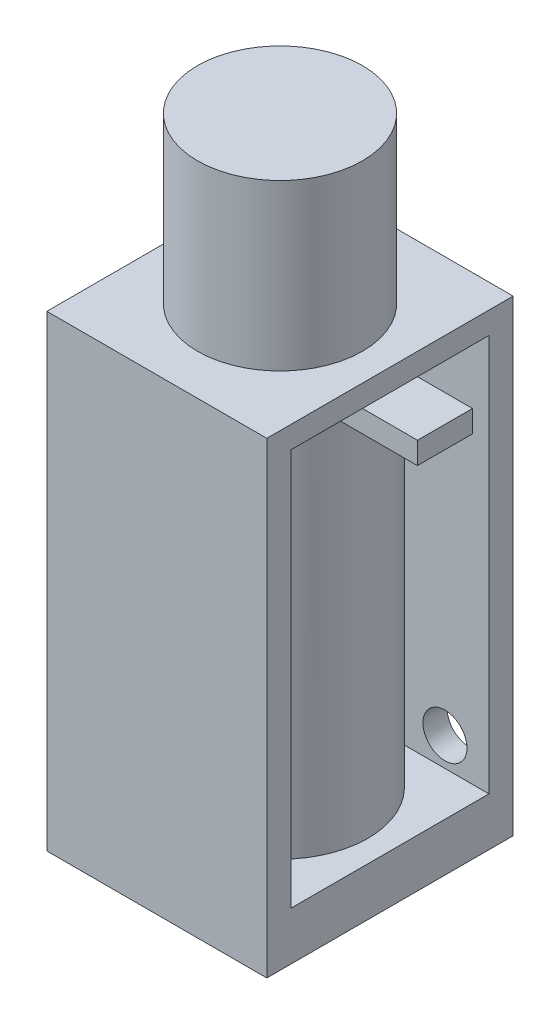
ISO-10303-21;
HEADER;
FILE_DESCRIPTION(('STEP AP214'),'2;1');
FILE_NAME('part.step','',(''),(''),'','','');
FILE_SCHEMA(('AUTOMOTIVE_DESIGN { 1 0 10303 214 1 1 1 1 }'));
ENDSEC;
DATA;
#1=APPLICATION_CONTEXT('core data for automotive mechanical design processes');
#2=APPLICATION_PROTOCOL_DEFINITION('international standard','automotive_design',2000,#1);
#3=PRODUCT_CONTEXT('',#1,'mechanical');
#4=PRODUCT('Part','Part','',(#3));
#5=PRODUCT_RELATED_PRODUCT_CATEGORY('part','',(#4));
#6=PRODUCT_DEFINITION_FORMATION('','',#4);
#7=PRODUCT_DEFINITION_CONTEXT('part definition',#1,'design');
#8=PRODUCT_DEFINITION('design','',#6,#7);
#9=PRODUCT_DEFINITION_SHAPE('','',#8);
#10=(LENGTH_UNIT() NAMED_UNIT(*) SI_UNIT(.MILLI.,.METRE.));
#11=(NAMED_UNIT(*) PLANE_ANGLE_UNIT() SI_UNIT($,.RADIAN.));
#12=(NAMED_UNIT(*) SI_UNIT($,.STERADIAN.) SOLID_ANGLE_UNIT());
#13=UNCERTAINTY_MEASURE_WITH_UNIT(LENGTH_MEASURE(1.E-05),#10,'distance_accuracy_value','');
#14=(GEOMETRIC_REPRESENTATION_CONTEXT(3) GLOBAL_UNCERTAINTY_ASSIGNED_CONTEXT((#13)) GLOBAL_UNIT_ASSIGNED_CONTEXT((#10,
#11,#12)) REPRESENTATION_CONTEXT('',''));
#15=CARTESIAN_POINT('',(0.,0.,0.));
#16=DIRECTION('',(0.,0.,1.));
#17=DIRECTION('',(1.,0.,0.));
#18=AXIS2_PLACEMENT_3D('',#15,#16,#17);
#19=CARTESIAN_POINT('',(0.,18.,0.));
#20=DIRECTION('',(0.,-1.,0.));
#21=DIRECTION('',(0.,0.,-1.));
#22=AXIS2_PLACEMENT_3D('',#19,#20,#21);
#23=CYLINDRICAL_SURFACE('',#22,4.);
#24=CARTESIAN_POINT('',(0.,17.05,0.));
#25=DIRECTION('',(0.,-1.,0.));
#26=DIRECTION('',(0.,0.,-1.));
#27=AXIS2_PLACEMENT_3D('',#24,#25,#26);
#28=CIRCLE('',#27,4.);
#29=CARTESIAN_POINT('',(3.79967103839267,17.05,-1.25));
#30=VERTEX_POINT('',#29);
#31=CARTESIAN_POINT('',(3.79967103839267,17.05,1.25));
#32=VERTEX_POINT('',#31);
#33=EDGE_CURVE('E11',#30,#32,#28,.T.);
#34=ORIENTED_EDGE('',*,*,#33,.T.);
#35=DIRECTION('',(0.,-1.,0.));
#36=VECTOR('',#35,1.);
#37=CARTESIAN_POINT('',(3.79967103839267,18.,1.25));
#38=LINE('',#37,#36);
#39=CARTESIAN_POINT('',(3.79967103839267,18.,1.25));
#40=VERTEX_POINT('',#39);
#41=EDGE_CURVE('E157',#32,#40,#38,.F.);
#42=ORIENTED_EDGE('',*,*,#41,.T.);
#43=CARTESIAN_POINT('',(0.,18.,0.));
#44=DIRECTION('',(0.,1.,0.));
#45=DIRECTION('',(0.,0.,1.));
#46=AXIS2_PLACEMENT_3D('',#43,#44,#45);
#47=CIRCLE('',#46,4.);
#48=CARTESIAN_POINT('',(3.79967103839267,18.,-1.25));
#49=VERTEX_POINT('',#48);
#50=EDGE_CURVE('E49',#49,#40,#47,.T.);
#51=ORIENTED_EDGE('',*,*,#50,.F.);
#52=DIRECTION('',(0.,-1.,0.));
#53=VECTOR('',#52,1.);
#54=CARTESIAN_POINT('',(3.79967103839267,18.,-1.25));
#55=LINE('',#54,#53);
#56=EDGE_CURVE('E56',#30,#49,#55,.F.);
#57=ORIENTED_EDGE('',*,*,#56,.F.);
#58=EDGE_LOOP('',(#34,#42,#51,#57));
#59=FACE_BOUND('',#58,.T.);
#60=CARTESIAN_POINT('',(0.,0.,0.));
#61=DIRECTION('',(0.,1.,0.));
#62=DIRECTION('',(0.,0.,1.));
#63=AXIS2_PLACEMENT_3D('',#60,#61,#62);
#64=CIRCLE('',#63,4.);
#65=CARTESIAN_POINT('',(0.,0.,4.));
#66=VERTEX_POINT('',#65);
#67=EDGE_CURVE('E336',#66,#66,#64,.T.);
#68=ORIENTED_EDGE('',*,*,#67,.T.);
#69=EDGE_LOOP('',(#68));
#70=FACE_BOUND('',#69,.T.);
#71=ADVANCED_FACE('F41',(#59,#70),#23,.T.);
#72=CARTESIAN_POINT('',(0.,18.,0.));
#73=DIRECTION('',(0.,1.,0.));
#74=DIRECTION('',(0.,0.,1.));
#75=AXIS2_PLACEMENT_3D('',#72,#73,#74);
#76=PLANE('',#75);
#77=DIRECTION('',(1.,0.,0.));
#78=VECTOR('',#77,1.);
#79=CARTESIAN_POINT('',(0.,18.,1.25));
#80=LINE('',#79,#78);
#81=CARTESIAN_POINT('',(3.,18.,1.25));
#82=VERTEX_POINT('',#81);
#83=EDGE_CURVE('E211',#82,#40,#80,.T.);
#84=ORIENTED_EDGE('',*,*,#83,.F.);
#85=DIRECTION('',(0.,0.,-1.));
#86=VECTOR('',#85,1.);
#87=CARTESIAN_POINT('',(3.,18.,0.));
#88=LINE('',#87,#86);
#89=CARTESIAN_POINT('',(3.,18.,-1.25));
#90=VERTEX_POINT('',#89);
#91=EDGE_CURVE('E207',#82,#90,#88,.T.);
#92=ORIENTED_EDGE('',*,*,#91,.T.);
#93=DIRECTION('',(1.,0.,0.));
#94=VECTOR('',#93,1.);
#95=CARTESIAN_POINT('',(0.,18.,-1.25));
#96=LINE('',#95,#94);
#97=EDGE_CURVE('E171',#90,#49,#96,.T.);
#98=ORIENTED_EDGE('',*,*,#97,.T.);
#99=ORIENTED_EDGE('',*,*,#50,.T.);
#100=EDGE_LOOP('',(#84,#92,#98,#99));
#101=FACE_BOUND('',#100,.T.);
#102=ADVANCED_FACE('F344',(#101),#76,.T.);
#103=CARTESIAN_POINT('',(5.,0.,0.));
#104=DIRECTION('',(1.,0.,0.));
#105=DIRECTION('',(0.,0.,-1.));
#106=AXIS2_PLACEMENT_3D('',#103,#104,#105);
#107=PLANE('',#106);
#108=DIRECTION('',(0.,-1.,0.));
#109=VECTOR('',#108,1.);
#110=CARTESIAN_POINT('',(5.,19.05,5.6));
#111=LINE('',#110,#109);
#112=CARTESIAN_POINT('',(5.,19.05,5.6));
#113=VERTEX_POINT('',#112);
#114=CARTESIAN_POINT('',(5.,-2.2,5.6));
#115=VERTEX_POINT('',#114);
#116=EDGE_CURVE('E295',#113,#115,#111,.T.);
#117=ORIENTED_EDGE('',*,*,#116,.T.);
#118=DIRECTION('',(0.,0.,-1.));
#119=VECTOR('',#118,1.);
#120=CARTESIAN_POINT('',(5.,-2.2,5.6));
#121=LINE('',#120,#119);
#122=CARTESIAN_POINT('',(5.,-2.2,-5.6));
#123=VERTEX_POINT('',#122);
#124=EDGE_CURVE('E299',#115,#123,#121,.T.);
#125=ORIENTED_EDGE('',*,*,#124,.T.);
#126=DIRECTION('',(0.,1.,0.));
#127=VECTOR('',#126,1.);
#128=CARTESIAN_POINT('',(5.,19.05,-5.6));
#129=LINE('',#128,#127);
#130=CARTESIAN_POINT('',(5.,19.05,-5.6));
#131=VERTEX_POINT('',#130);
#132=EDGE_CURVE('E303',#123,#131,#129,.T.);
#133=ORIENTED_EDGE('',*,*,#132,.T.);
#134=DIRECTION('',(0.,0.,1.));
#135=VECTOR('',#134,1.);
#136=CARTESIAN_POINT('',(5.,19.05,5.6));
#137=LINE('',#136,#135);
#138=EDGE_CURVE('E306',#131,#113,#137,.T.);
#139=ORIENTED_EDGE('',*,*,#138,.T.);
#140=EDGE_LOOP('',(#117,#125,#133,#139));
#141=FACE_BOUND('',#140,.T.);
#142=DIRECTION('',(0.,0.,-1.));
#143=VECTOR('',#142,1.);
#144=CARTESIAN_POINT('',(5.,0.,4.5));
#145=LINE('',#144,#143);
#146=CARTESIAN_POINT('',(5.,0.,4.5));
#147=VERTEX_POINT('',#146);
#148=CARTESIAN_POINT('',(5.,0.,-4.5));
#149=VERTEX_POINT('',#148);
#150=EDGE_CURVE('E252',#147,#149,#145,.T.);
#151=ORIENTED_EDGE('',*,*,#150,.F.);
#152=DIRECTION('',(0.,-1.,0.));
#153=VECTOR('',#152,1.);
#154=CARTESIAN_POINT('',(5.,0.,4.5));
#155=LINE('',#154,#153);
#156=CARTESIAN_POINT('',(5.,18.05,4.5));
#157=VERTEX_POINT('',#156);
#158=EDGE_CURVE('E249',#157,#147,#155,.T.);
#159=ORIENTED_EDGE('',*,*,#158,.F.);
#160=DIRECTION('',(0.,0.,1.));
#161=VECTOR('',#160,1.);
#162=CARTESIAN_POINT('',(5.,18.05,4.5));
#163=LINE('',#162,#161);
#164=CARTESIAN_POINT('',(5.,18.05,1.25));
#165=VERTEX_POINT('',#164);
#166=EDGE_CURVE('E260',#165,#157,#163,.T.);
#167=ORIENTED_EDGE('',*,*,#166,.F.);
#168=CARTESIAN_POINT('',(5.,18.05,-1.25));
#169=VERTEX_POINT('',#168);
#170=EDGE_CURVE('E266',#169,#165,#163,.T.);
#171=ORIENTED_EDGE('',*,*,#170,.F.);
#172=CARTESIAN_POINT('',(5.,18.05,-4.5));
#173=VERTEX_POINT('',#172);
#174=EDGE_CURVE('E261',#173,#169,#163,.T.);
#175=ORIENTED_EDGE('',*,*,#174,.F.);
#176=DIRECTION('',(0.,1.,0.));
#177=VECTOR('',#176,1.);
#178=CARTESIAN_POINT('',(5.,0.,-4.5));
#179=LINE('',#178,#177);
#180=EDGE_CURVE('E256',#149,#173,#179,.T.);
#181=ORIENTED_EDGE('',*,*,#180,.F.);
#182=EDGE_LOOP('',(#151,#159,#167,#171,#175,#181));
#183=FACE_BOUND('',#182,.T.);
#184=ADVANCED_FACE('F363',(#141,#183),#107,.T.);
#185=CARTESIAN_POINT('',(-5.,0.,0.));
#186=DIRECTION('',(1.,0.,0.));
#187=DIRECTION('',(0.,0.,-1.));
#188=AXIS2_PLACEMENT_3D('',#185,#186,#187);
#189=PLANE('',#188);
#190=DIRECTION('',(0.,-1.,0.));
#191=VECTOR('',#190,1.);
#192=CARTESIAN_POINT('',(-5.,19.05,5.6));
#193=LINE('',#192,#191);
#194=CARTESIAN_POINT('',(-5.,19.05,5.6));
#195=VERTEX_POINT('',#194);
#196=CARTESIAN_POINT('',(-5.,-2.2,5.6));
#197=VERTEX_POINT('',#196);
#198=EDGE_CURVE('E294',#195,#197,#193,.T.);
#199=ORIENTED_EDGE('',*,*,#198,.F.);
#200=DIRECTION('',(0.,0.,1.));
#201=VECTOR('',#200,1.);
#202=CARTESIAN_POINT('',(-5.,19.05,5.6));
#203=LINE('',#202,#201);
#204=CARTESIAN_POINT('',(-5.,19.05,-5.6));
#205=VERTEX_POINT('',#204);
#206=EDGE_CURVE('E300',#205,#195,#203,.T.);
#207=ORIENTED_EDGE('',*,*,#206,.F.);
#208=DIRECTION('',(0.,1.,0.));
#209=VECTOR('',#208,1.);
#210=CARTESIAN_POINT('',(-5.,19.05,-5.6));
#211=LINE('',#210,#209);
#212=CARTESIAN_POINT('',(-5.,-2.2,-5.6));
#213=VERTEX_POINT('',#212);
#214=EDGE_CURVE('E316',#213,#205,#211,.T.);
#215=ORIENTED_EDGE('',*,*,#214,.F.);
#216=DIRECTION('',(0.,0.,-1.));
#217=VECTOR('',#216,1.);
#218=CARTESIAN_POINT('',(-5.,-2.2,5.6));
#219=LINE('',#218,#217);
#220=EDGE_CURVE('E313',#197,#213,#219,.T.);
#221=ORIENTED_EDGE('',*,*,#220,.F.);
#222=EDGE_LOOP('',(#199,#207,#215,#221));
#223=FACE_BOUND('',#222,.T.);
#224=DIRECTION('',(0.,-1.,0.));
#225=VECTOR('',#224,1.);
#226=CARTESIAN_POINT('',(-5.,0.,4.5));
#227=LINE('',#226,#225);
#228=CARTESIAN_POINT('',(-5.,18.05,4.5));
#229=VERTEX_POINT('',#228);
#230=CARTESIAN_POINT('',(-5.,0.,4.5));
#231=VERTEX_POINT('',#230);
#232=EDGE_CURVE('E245',#229,#231,#227,.T.);
#233=ORIENTED_EDGE('',*,*,#232,.T.);
#234=DIRECTION('',(0.,0.,-1.));
#235=VECTOR('',#234,1.);
#236=CARTESIAN_POINT('',(-5.,0.,4.5));
#237=LINE('',#236,#235);
#238=CARTESIAN_POINT('',(-5.,0.,-4.5));
#239=VERTEX_POINT('',#238);
#240=EDGE_CURVE('E270',#231,#239,#237,.T.);
#241=ORIENTED_EDGE('',*,*,#240,.T.);
#242=DIRECTION('',(0.,1.,0.));
#243=VECTOR('',#242,1.);
#244=CARTESIAN_POINT('',(-5.,0.,-4.5));
#245=LINE('',#244,#243);
#246=CARTESIAN_POINT('',(-5.,18.05,-4.5));
#247=VERTEX_POINT('',#246);
#248=EDGE_CURVE('E274',#239,#247,#245,.T.);
#249=ORIENTED_EDGE('',*,*,#248,.T.);
#250=DIRECTION('',(0.,0.,1.));
#251=VECTOR('',#250,1.);
#252=CARTESIAN_POINT('',(-5.,18.05,4.5));
#253=LINE('',#252,#251);
#254=EDGE_CURVE('E253',#247,#229,#253,.T.);
#255=ORIENTED_EDGE('',*,*,#254,.T.);
#256=EDGE_LOOP('',(#233,#241,#249,#255));
#257=FACE_BOUND('',#256,.T.);
#258=ADVANCED_FACE('F376',(#223,#257),#189,.F.);
#259=CARTESIAN_POINT('',(5.,19.05,5.6));
#260=DIRECTION('',(0.,0.,-1.));
#261=DIRECTION('',(0.,1.,0.));
#262=AXIS2_PLACEMENT_3D('',#259,#260,#261);
#263=PLANE('',#262);
#264=ORIENTED_EDGE('',*,*,#198,.T.);
#265=DIRECTION('',(-1.,0.,0.));
#266=VECTOR('',#265,1.);
#267=CARTESIAN_POINT('',(5.,-2.2,5.6));
#268=LINE('',#267,#266);
#269=EDGE_CURVE('E332',#115,#197,#268,.T.);
#270=ORIENTED_EDGE('',*,*,#269,.F.);
#271=ORIENTED_EDGE('',*,*,#116,.F.);
#272=DIRECTION('',(-1.,0.,0.));
#273=VECTOR('',#272,1.);
#274=CARTESIAN_POINT('',(5.,19.05,5.6));
#275=LINE('',#274,#273);
#276=EDGE_CURVE('E309',#113,#195,#275,.T.);
#277=ORIENTED_EDGE('',*,*,#276,.T.);
#278=EDGE_LOOP('',(#264,#270,#271,#277));
#279=FACE_BOUND('',#278,.T.);
#280=ADVANCED_FACE('F402',(#279),#263,.F.);
#281=CARTESIAN_POINT('',(5.,-2.2,5.6));
#282=DIRECTION('',(0.,1.,0.));
#283=DIRECTION('',(0.,0.,1.));
#284=AXIS2_PLACEMENT_3D('',#281,#282,#283);
#285=PLANE('',#284);
#286=CARTESIAN_POINT('',(0.,-2.2,0.));
#287=DIRECTION('',(0.,1.,0.));
#288=DIRECTION('',(0.,0.,1.));
#289=AXIS2_PLACEMENT_3D('',#286,#287,#288);
#290=CIRCLE('',#289,1.5);
#291=CARTESIAN_POINT('',(0.,-2.2,1.5));
#292=VERTEX_POINT('',#291);
#293=EDGE_CURVE('E226',#292,#292,#290,.T.);
#294=ORIENTED_EDGE('',*,*,#293,.T.);
#295=EDGE_LOOP('',(#294));
#296=FACE_BOUND('',#295,.T.);
#297=ORIENTED_EDGE('',*,*,#220,.T.);
#298=DIRECTION('',(-1.,0.,0.));
#299=VECTOR('',#298,1.);
#300=CARTESIAN_POINT('',(5.,-2.2,-5.6));
#301=LINE('',#300,#299);
#302=EDGE_CURVE('E328',#123,#213,#301,.T.);
#303=ORIENTED_EDGE('',*,*,#302,.F.);
#304=ORIENTED_EDGE('',*,*,#124,.F.);
#305=ORIENTED_EDGE('',*,*,#269,.T.);
#306=EDGE_LOOP('',(#297,#303,#304,#305));
#307=FACE_BOUND('',#306,.T.);
#308=ADVANCED_FACE('F405',(#296,#307),#285,.F.);
#309=CARTESIAN_POINT('',(5.,19.05,-5.6));
#310=DIRECTION('',(0.,0.,1.));
#311=DIRECTION('',(0.,-1.,0.));
#312=AXIS2_PLACEMENT_3D('',#309,#310,#311);
#313=PLANE('',#312);
#314=CARTESIAN_POINT('',(3.,1.3,-5.6));
#315=DIRECTION('',(0.,0.,-1.));
#316=DIRECTION('',(0.,1.,0.));
#317=AXIS2_PLACEMENT_3D('',#314,#315,#316);
#318=CIRCLE('',#317,1.);
#319=CARTESIAN_POINT('',(3.,2.3,-5.6));
#320=VERTEX_POINT('',#319);
#321=EDGE_CURVE('E217',#320,#320,#318,.T.);
#322=ORIENTED_EDGE('',*,*,#321,.F.);
#323=EDGE_LOOP('',(#322));
#324=FACE_BOUND('',#323,.T.);
#325=CARTESIAN_POINT('',(-3.,11.3,-5.6));
#326=DIRECTION('',(0.,0.,-1.));
#327=DIRECTION('',(0.,1.,0.));
#328=AXIS2_PLACEMENT_3D('',#325,#326,#327);
#329=CIRCLE('',#328,1.);
#330=CARTESIAN_POINT('',(-3.,12.3,-5.6));
#331=VERTEX_POINT('',#330);
#332=EDGE_CURVE('E216',#331,#331,#329,.T.);
#333=ORIENTED_EDGE('',*,*,#332,.F.);
#334=EDGE_LOOP('',(#333));
#335=FACE_BOUND('',#334,.T.);
#336=ORIENTED_EDGE('',*,*,#214,.T.);
#337=DIRECTION('',(-1.,0.,0.));
#338=VECTOR('',#337,1.);
#339=CARTESIAN_POINT('',(5.,19.05,-5.6));
#340=LINE('',#339,#338);
#341=EDGE_CURVE('E324',#131,#205,#340,.T.);
#342=ORIENTED_EDGE('',*,*,#341,.F.);
#343=ORIENTED_EDGE('',*,*,#132,.F.);
#344=ORIENTED_EDGE('',*,*,#302,.T.);
#345=EDGE_LOOP('',(#336,#342,#343,#344));
#346=FACE_BOUND('',#345,.T.);
#347=ADVANCED_FACE('F409',(#324,#335,#346),#313,.F.);
#348=CARTESIAN_POINT('',(5.,19.05,5.6));
#349=DIRECTION('',(0.,-1.,0.));
#350=DIRECTION('',(0.,0.,-1.));
#351=AXIS2_PLACEMENT_3D('',#348,#349,#350);
#352=PLANE('',#351);
#353=CARTESIAN_POINT('',(0.,19.05,0.));
#354=DIRECTION('',(0.,-1.,0.));
#355=DIRECTION('',(0.,0.,-1.));
#356=AXIS2_PLACEMENT_3D('',#353,#354,#355);
#357=CIRCLE('',#356,3.75);
#358=CARTESIAN_POINT('',(0.,19.05,-3.75));
#359=VERTEX_POINT('',#358);
#360=EDGE_CURVE('E237',#359,#359,#357,.T.);
#361=ORIENTED_EDGE('',*,*,#360,.T.);
#362=EDGE_LOOP('',(#361));
#363=FACE_BOUND('',#362,.T.);
#364=ORIENTED_EDGE('',*,*,#206,.T.);
#365=ORIENTED_EDGE('',*,*,#276,.F.);
#366=ORIENTED_EDGE('',*,*,#138,.F.);
#367=ORIENTED_EDGE('',*,*,#341,.T.);
#368=EDGE_LOOP('',(#364,#365,#366,#367));
#369=FACE_BOUND('',#368,.T.);
#370=ADVANCED_FACE('F413',(#363,#369),#352,.F.);
#371=CARTESIAN_POINT('',(5.,0.,4.5));
#372=DIRECTION('',(0.,0.,-1.));
#373=DIRECTION('',(-1.,0.,0.));
#374=AXIS2_PLACEMENT_3D('',#371,#372,#373);
#375=PLANE('',#374);
#376=ORIENTED_EDGE('',*,*,#232,.F.);
#377=DIRECTION('',(-1.,0.,0.));
#378=VECTOR('',#377,1.);
#379=CARTESIAN_POINT('',(5.,18.05,4.5));
#380=LINE('',#379,#378);
#381=EDGE_CURVE('E265',#157,#229,#380,.T.);
#382=ORIENTED_EDGE('',*,*,#381,.F.);
#383=ORIENTED_EDGE('',*,*,#158,.T.);
#384=DIRECTION('',(-1.,0.,0.));
#385=VECTOR('',#384,1.);
#386=CARTESIAN_POINT('',(5.,0.,4.5));
#387=LINE('',#386,#385);
#388=EDGE_CURVE('E290',#147,#231,#387,.T.);
#389=ORIENTED_EDGE('',*,*,#388,.T.);
#390=EDGE_LOOP('',(#376,#382,#383,#389));
#391=FACE_BOUND('',#390,.T.);
#392=ADVANCED_FACE('F370',(#391),#375,.T.);
#393=CARTESIAN_POINT('',(5.,0.,4.5));
#394=DIRECTION('',(0.,1.,0.));
#395=DIRECTION('',(0.,0.,1.));
#396=AXIS2_PLACEMENT_3D('',#393,#394,#395);
#397=PLANE('',#396);
#398=ORIENTED_EDGE('',*,*,#67,.F.);
#399=EDGE_LOOP('',(#398));
#400=FACE_BOUND('',#399,.T.);
#401=ORIENTED_EDGE('',*,*,#240,.F.);
#402=ORIENTED_EDGE('',*,*,#388,.F.);
#403=ORIENTED_EDGE('',*,*,#150,.T.);
#404=DIRECTION('',(-1.,0.,0.));
#405=VECTOR('',#404,1.);
#406=CARTESIAN_POINT('',(5.,0.,-4.5));
#407=LINE('',#406,#405);
#408=EDGE_CURVE('E287',#149,#239,#407,.T.);
#409=ORIENTED_EDGE('',*,*,#408,.T.);
#410=EDGE_LOOP('',(#401,#402,#403,#409));
#411=FACE_BOUND('',#410,.T.);
#412=ADVANCED_FACE('F372',(#400,#411),#397,.T.);
#413=CARTESIAN_POINT('',(5.,0.,-4.5));
#414=DIRECTION('',(0.,0.,1.));
#415=DIRECTION('',(1.,0.,0.));
#416=AXIS2_PLACEMENT_3D('',#413,#414,#415);
#417=PLANE('',#416);
#418=CARTESIAN_POINT('',(3.,1.3,-4.5));
#419=DIRECTION('',(0.,0.,1.));
#420=DIRECTION('',(1.,0.,0.));
#421=AXIS2_PLACEMENT_3D('',#418,#419,#420);
#422=CIRCLE('',#421,1.);
#423=CARTESIAN_POINT('',(4.,1.3,-4.5));
#424=VERTEX_POINT('',#423);
#425=EDGE_CURVE('E221',#424,#424,#422,.F.);
#426=ORIENTED_EDGE('',*,*,#425,.T.);
#427=EDGE_LOOP('',(#426));
#428=FACE_BOUND('',#427,.T.);
#429=CARTESIAN_POINT('',(-3.,11.3,-4.5));
#430=DIRECTION('',(0.,0.,1.));
#431=DIRECTION('',(1.,0.,0.));
#432=AXIS2_PLACEMENT_3D('',#429,#430,#431);
#433=CIRCLE('',#432,1.);
#434=CARTESIAN_POINT('',(-2.,11.3,-4.5));
#435=VERTEX_POINT('',#434);
#436=EDGE_CURVE('E222',#435,#435,#433,.F.);
#437=ORIENTED_EDGE('',*,*,#436,.T.);
#438=EDGE_LOOP('',(#437));
#439=FACE_BOUND('',#438,.T.);
#440=ORIENTED_EDGE('',*,*,#248,.F.);
#441=ORIENTED_EDGE('',*,*,#408,.F.);
#442=ORIENTED_EDGE('',*,*,#180,.T.);
#443=DIRECTION('',(-1.,0.,0.));
#444=VECTOR('',#443,1.);
#445=CARTESIAN_POINT('',(5.,18.05,-4.5));
#446=LINE('',#445,#444);
#447=EDGE_CURVE('E284',#173,#247,#446,.T.);
#448=ORIENTED_EDGE('',*,*,#447,.T.);
#449=EDGE_LOOP('',(#440,#441,#442,#448));
#450=FACE_BOUND('',#449,.T.);
#451=ADVANCED_FACE('F379',(#428,#439,#450),#417,.T.);
#452=CARTESIAN_POINT('',(5.,18.05,4.5));
#453=DIRECTION('',(0.,-1.,0.));
#454=DIRECTION('',(0.,0.,-1.));
#455=AXIS2_PLACEMENT_3D('',#452,#453,#454);
#456=PLANE('',#455);
#457=DIRECTION('',(1.,0.,0.));
#458=VECTOR('',#457,1.);
#459=CARTESIAN_POINT('',(0.,18.05,1.25));
#460=LINE('',#459,#458);
#461=CARTESIAN_POINT('',(3.,18.05,1.25));
#462=VERTEX_POINT('',#461);
#463=EDGE_CURVE('E190',#462,#165,#460,.T.);
#464=ORIENTED_EDGE('',*,*,#463,.T.);
#465=ORIENTED_EDGE('',*,*,#166,.T.);
#466=ORIENTED_EDGE('',*,*,#381,.T.);
#467=ORIENTED_EDGE('',*,*,#254,.F.);
#468=ORIENTED_EDGE('',*,*,#447,.F.);
#469=ORIENTED_EDGE('',*,*,#174,.T.);
#470=DIRECTION('',(1.,0.,0.));
#471=VECTOR('',#470,1.);
#472=CARTESIAN_POINT('',(0.,18.05,-1.25));
#473=LINE('',#472,#471);
#474=CARTESIAN_POINT('',(3.,18.05,-1.25));
#475=VERTEX_POINT('',#474);
#476=EDGE_CURVE('E177',#475,#169,#473,.T.);
#477=ORIENTED_EDGE('',*,*,#476,.F.);
#478=DIRECTION('',(0.,0.,-1.));
#479=VECTOR('',#478,1.);
#480=CARTESIAN_POINT('',(3.,18.05,0.));
#481=LINE('',#480,#479);
#482=EDGE_CURVE('E64',#462,#475,#481,.T.);
#483=ORIENTED_EDGE('',*,*,#482,.F.);
#484=EDGE_LOOP('',(#464,#465,#466,#467,#468,#469,#477,#483));
#485=FACE_BOUND('',#484,.T.);
#486=ADVANCED_FACE('F357',(#485),#456,.T.);
#487=CARTESIAN_POINT('',(0.,26.55,0.));
#488=DIRECTION('',(0.,-1.,0.));
#489=DIRECTION('',(0.,0.,-1.));
#490=AXIS2_PLACEMENT_3D('',#487,#488,#489);
#491=CYLINDRICAL_SURFACE('',#490,3.75);
#492=CARTESIAN_POINT('',(0.,26.55,0.));
#493=DIRECTION('',(0.,-1.,0.));
#494=DIRECTION('',(0.,0.,-1.));
#495=AXIS2_PLACEMENT_3D('',#492,#493,#494);
#496=CIRCLE('',#495,3.75);
#497=CARTESIAN_POINT('',(0.,26.55,-3.75));
#498=VERTEX_POINT('',#497);
#499=EDGE_CURVE('E241',#498,#498,#496,.T.);
#500=ORIENTED_EDGE('',*,*,#499,.T.);
#501=EDGE_LOOP('',(#500));
#502=FACE_BOUND('',#501,.T.);
#503=ORIENTED_EDGE('',*,*,#360,.F.);
#504=EDGE_LOOP('',(#503));
#505=FACE_BOUND('',#504,.T.);
#506=ADVANCED_FACE('F387',(#502,#505),#491,.T.);
#507=CARTESIAN_POINT('',(0.,26.55,0.));
#508=DIRECTION('',(0.,-1.,0.));
#509=DIRECTION('',(0.,0.,-1.));
#510=AXIS2_PLACEMENT_3D('',#507,#508,#509);
#511=PLANE('',#510);
#512=ORIENTED_EDGE('',*,*,#499,.F.);
#513=EDGE_LOOP('',(#512));
#514=FACE_BOUND('',#513,.T.);
#515=ADVANCED_FACE('F446',(#514),#511,.F.);
#516=CARTESIAN_POINT('',(0.,-3.7,0.));
#517=DIRECTION('',(0.,1.,0.));
#518=DIRECTION('',(0.,0.,1.));
#519=AXIS2_PLACEMENT_3D('',#516,#517,#518);
#520=CYLINDRICAL_SURFACE('',#519,1.5);
#521=CARTESIAN_POINT('',(0.,-3.7,0.));
#522=DIRECTION('',(0.,1.,0.));
#523=DIRECTION('',(0.,0.,1.));
#524=AXIS2_PLACEMENT_3D('',#521,#522,#523);
#525=CIRCLE('',#524,1.5);
#526=CARTESIAN_POINT('',(0.,-3.7,1.5));
#527=VERTEX_POINT('',#526);
#528=EDGE_CURVE('E233',#527,#527,#525,.T.);
#529=ORIENTED_EDGE('',*,*,#528,.T.);
#530=EDGE_LOOP('',(#529));
#531=FACE_BOUND('',#530,.T.);
#532=ORIENTED_EDGE('',*,*,#293,.F.);
#533=EDGE_LOOP('',(#532));
#534=FACE_BOUND('',#533,.T.);
#535=ADVANCED_FACE('F457',(#531,#534),#520,.T.);
#536=CARTESIAN_POINT('',(0.,-3.7,0.));
#537=DIRECTION('',(0.,1.,0.));
#538=DIRECTION('',(0.,0.,1.));
#539=AXIS2_PLACEMENT_3D('',#536,#537,#538);
#540=PLANE('',#539);
#541=ORIENTED_EDGE('',*,*,#528,.F.);
#542=EDGE_LOOP('',(#541));
#543=FACE_BOUND('',#542,.T.);
#544=ADVANCED_FACE('F474',(#543),#540,.F.);
#545=CARTESIAN_POINT('',(-3.,11.3,-1.67157287525381));
#546=DIRECTION('',(0.,0.,-1.));
#547=DIRECTION('',(0.,1.,0.));
#548=AXIS2_PLACEMENT_3D('',#545,#546,#547);
#549=CYLINDRICAL_SURFACE('',#548,1.);
#550=ORIENTED_EDGE('',*,*,#332,.T.);
#551=EDGE_LOOP('',(#550));
#552=FACE_BOUND('',#551,.T.);
#553=ORIENTED_EDGE('',*,*,#436,.F.);
#554=EDGE_LOOP('',(#553));
#555=FACE_BOUND('',#554,.T.);
#556=ADVANCED_FACE('F484',(#552,#555),#549,.F.);
#557=CARTESIAN_POINT('',(3.,1.3,-1.67157287525381));
#558=DIRECTION('',(0.,0.,-1.));
#559=DIRECTION('',(0.,1.,0.));
#560=AXIS2_PLACEMENT_3D('',#557,#558,#559);
#561=CYLINDRICAL_SURFACE('',#560,1.);
#562=ORIENTED_EDGE('',*,*,#321,.T.);
#563=EDGE_LOOP('',(#562));
#564=FACE_BOUND('',#563,.T.);
#565=ORIENTED_EDGE('',*,*,#425,.F.);
#566=EDGE_LOOP('',(#565));
#567=FACE_BOUND('',#566,.T.);
#568=ADVANCED_FACE('F502',(#564,#567),#561,.F.);
#569=CARTESIAN_POINT('',(0.,17.05,1.25));
#570=DIRECTION('',(0.,0.,1.));
#571=DIRECTION('',(1.,0.,0.));
#572=AXIS2_PLACEMENT_3D('',#569,#570,#571);
#573=PLANE('',#572);
#574=ORIENTED_EDGE('',*,*,#41,.F.);
#575=DIRECTION('',(1.,0.,0.));
#576=VECTOR('',#575,1.);
#577=CARTESIAN_POINT('',(0.,17.05,1.25));
#578=LINE('',#577,#576);
#579=CARTESIAN_POINT('',(7.5,17.05,1.25));
#580=VERTEX_POINT('',#579);
#581=EDGE_CURVE('E150',#32,#580,#578,.T.);
#582=ORIENTED_EDGE('',*,*,#581,.T.);
#583=DIRECTION('',(0.,1.,0.));
#584=VECTOR('',#583,1.);
#585=CARTESIAN_POINT('',(7.5,17.05,1.25));
#586=LINE('',#585,#584);
#587=CARTESIAN_POINT('',(7.5,18.05,1.25));
#588=VERTEX_POINT('',#587);
#589=EDGE_CURVE('E154',#580,#588,#586,.T.);
#590=ORIENTED_EDGE('',*,*,#589,.T.);
#591=EDGE_CURVE('E189',#165,#588,#460,.T.);
#592=ORIENTED_EDGE('',*,*,#591,.F.);
#593=ORIENTED_EDGE('',*,*,#463,.F.);
#594=DIRECTION('',(0.,1.,0.));
#595=VECTOR('',#594,1.);
#596=CARTESIAN_POINT('',(3.,17.05,1.25));
#597=LINE('',#596,#595);
#598=EDGE_CURVE('E172',#82,#462,#597,.T.);
#599=ORIENTED_EDGE('',*,*,#598,.F.);
#600=ORIENTED_EDGE('',*,*,#83,.T.);
#601=EDGE_LOOP('',(#574,#582,#590,#592,#593,#599,#600));
#602=FACE_BOUND('',#601,.T.);
#603=ADVANCED_FACE('F152',(#602),#573,.T.);
#604=CARTESIAN_POINT('',(0.,17.05,-1.25));
#605=DIRECTION('',(0.,0.,1.));
#606=DIRECTION('',(1.,0.,0.));
#607=AXIS2_PLACEMENT_3D('',#604,#605,#606);
#608=PLANE('',#607);
#609=DIRECTION('',(1.,0.,0.));
#610=VECTOR('',#609,1.);
#611=CARTESIAN_POINT('',(0.,17.05,-1.25));
#612=LINE('',#611,#610);
#613=CARTESIAN_POINT('',(7.5,17.05,-1.25));
#614=VERTEX_POINT('',#613);
#615=EDGE_CURVE('E161',#30,#614,#612,.T.);
#616=ORIENTED_EDGE('',*,*,#615,.F.);
#617=ORIENTED_EDGE('',*,*,#56,.T.);
#618=ORIENTED_EDGE('',*,*,#97,.F.);
#619=DIRECTION('',(0.,1.,0.));
#620=VECTOR('',#619,1.);
#621=CARTESIAN_POINT('',(3.,17.05,-1.25));
#622=LINE('',#621,#620);
#623=EDGE_CURVE('E198',#90,#475,#622,.T.);
#624=ORIENTED_EDGE('',*,*,#623,.T.);
#625=ORIENTED_EDGE('',*,*,#476,.T.);
#626=CARTESIAN_POINT('',(7.5,18.05,-1.25));
#627=VERTEX_POINT('',#626);
#628=EDGE_CURVE('E181',#169,#627,#473,.T.);
#629=ORIENTED_EDGE('',*,*,#628,.T.);
#630=DIRECTION('',(0.,1.,0.));
#631=VECTOR('',#630,1.);
#632=CARTESIAN_POINT('',(7.5,17.05,-1.25));
#633=LINE('',#632,#631);
#634=EDGE_CURVE('E186',#614,#627,#633,.T.);
#635=ORIENTED_EDGE('',*,*,#634,.F.);
#636=EDGE_LOOP('',(#616,#617,#618,#624,#625,#629,#635));
#637=FACE_BOUND('',#636,.T.);
#638=ADVANCED_FACE('F347',(#637),#608,.F.);
#639=CARTESIAN_POINT('',(7.5,17.05,0.));
#640=DIRECTION('',(1.,0.,0.));
#641=DIRECTION('',(0.,0.,-1.));
#642=AXIS2_PLACEMENT_3D('',#639,#640,#641);
#643=PLANE('',#642);
#644=DIRECTION('',(0.,0.,-1.));
#645=VECTOR('',#644,1.);
#646=CARTESIAN_POINT('',(7.5,18.05,0.));
#647=LINE('',#646,#645);
#648=EDGE_CURVE('E169',#588,#627,#647,.T.);
#649=ORIENTED_EDGE('',*,*,#648,.F.);
#650=ORIENTED_EDGE('',*,*,#589,.F.);
#651=DIRECTION('',(0.,0.,-1.));
#652=VECTOR('',#651,1.);
#653=CARTESIAN_POINT('',(7.5,17.05,0.));
#654=LINE('',#653,#652);
#655=EDGE_CURVE('E162',#580,#614,#654,.T.);
#656=ORIENTED_EDGE('',*,*,#655,.T.);
#657=ORIENTED_EDGE('',*,*,#634,.T.);
#658=EDGE_LOOP('',(#649,#650,#656,#657));
#659=FACE_BOUND('',#658,.T.);
#660=ADVANCED_FACE('F166',(#659),#643,.T.);
#661=CARTESIAN_POINT('',(3.,17.05,0.));
#662=DIRECTION('',(1.,0.,0.));
#663=DIRECTION('',(0.,0.,-1.));
#664=AXIS2_PLACEMENT_3D('',#661,#662,#663);
#665=PLANE('',#664);
#666=ORIENTED_EDGE('',*,*,#91,.F.);
#667=ORIENTED_EDGE('',*,*,#598,.T.);
#668=ORIENTED_EDGE('',*,*,#482,.T.);
#669=ORIENTED_EDGE('',*,*,#623,.F.);
#670=EDGE_LOOP('',(#666,#667,#668,#669));
#671=FACE_BOUND('',#670,.T.);
#672=ADVANCED_FACE('F557',(#671),#665,.F.);
#673=CARTESIAN_POINT('',(0.,17.05,0.));
#674=DIRECTION('',(0.,-1.,0.));
#675=DIRECTION('',(0.,0.,-1.));
#676=AXIS2_PLACEMENT_3D('',#673,#674,#675);
#677=PLANE('',#676);
#678=ORIENTED_EDGE('',*,*,#33,.F.);
#679=ORIENTED_EDGE('',*,*,#615,.T.);
#680=ORIENTED_EDGE('',*,*,#655,.F.);
#681=ORIENTED_EDGE('',*,*,#581,.F.);
#682=EDGE_LOOP('',(#678,#679,#680,#681));
#683=FACE_BOUND('',#682,.T.);
#684=ADVANCED_FACE('F174',(#683),#677,.T.);
#685=CARTESIAN_POINT('',(0.,18.05,0.));
#686=DIRECTION('',(0.,-1.,0.));
#687=DIRECTION('',(0.,0.,-1.));
#688=AXIS2_PLACEMENT_3D('',#685,#686,#687);
#689=PLANE('',#688);
#690=ORIENTED_EDGE('',*,*,#170,.T.);
#691=ORIENTED_EDGE('',*,*,#591,.T.);
#692=ORIENTED_EDGE('',*,*,#648,.T.);
#693=ORIENTED_EDGE('',*,*,#628,.F.);
#694=EDGE_LOOP('',(#690,#691,#692,#693));
#695=FACE_BOUND('',#694,.T.);
#696=ADVANCED_FACE('F349',(#695),#689,.F.);
#697=CLOSED_SHELL('',(#71,#102,#184,#258,#280,#308,#347,#370,#392,#412,#451,#486,#506,#515,#535,
#544,#556,#568,#603,#638,#660,#672,#684,#696));
#698=MANIFOLD_SOLID_BREP('B2',#697);
#699=ADVANCED_BREP_SHAPE_REPRESENTATION('',(#18,#698),#14);
#700=SHAPE_DEFINITION_REPRESENTATION(#9,#699);
ENDSEC;
END-ISO-10303-21;
